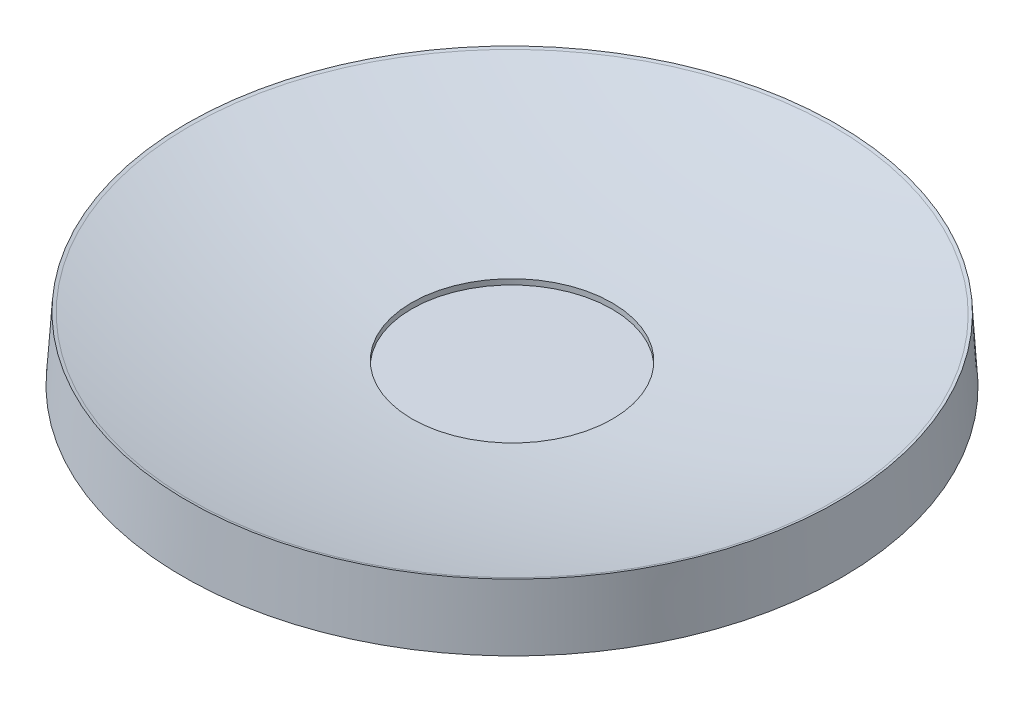
ISO-10303-21;
HEADER;
FILE_DESCRIPTION(('STEP AP214'),'2;1');
FILE_NAME('part.step','',(''),(''),'','','');
FILE_SCHEMA(('AUTOMOTIVE_DESIGN { 1 0 10303 214 1 1 1 1 }'));
ENDSEC;
DATA;
#1=APPLICATION_CONTEXT('core data for automotive mechanical design processes');
#2=APPLICATION_PROTOCOL_DEFINITION('international standard','automotive_design',2000,#1);
#3=PRODUCT_CONTEXT('',#1,'mechanical');
#4=PRODUCT('Part','Part','',(#3));
#5=PRODUCT_RELATED_PRODUCT_CATEGORY('part','',(#4));
#6=PRODUCT_DEFINITION_FORMATION('','',#4);
#7=PRODUCT_DEFINITION_CONTEXT('part definition',#1,'design');
#8=PRODUCT_DEFINITION('design','',#6,#7);
#9=PRODUCT_DEFINITION_SHAPE('','',#8);
#10=(LENGTH_UNIT() NAMED_UNIT(*) SI_UNIT(.MILLI.,.METRE.));
#11=(NAMED_UNIT(*) PLANE_ANGLE_UNIT() SI_UNIT($,.RADIAN.));
#12=(NAMED_UNIT(*) SI_UNIT($,.STERADIAN.) SOLID_ANGLE_UNIT());
#13=UNCERTAINTY_MEASURE_WITH_UNIT(LENGTH_MEASURE(1.E-05),#10,'distance_accuracy_value','');
#14=(GEOMETRIC_REPRESENTATION_CONTEXT(3) GLOBAL_UNCERTAINTY_ASSIGNED_CONTEXT((#13)) GLOBAL_UNIT_ASSIGNED_CONTEXT((#10,
#11,#12)) REPRESENTATION_CONTEXT('',''));
#15=CARTESIAN_POINT('',(0.,0.,0.));
#16=DIRECTION('',(0.,0.,1.));
#17=DIRECTION('',(1.,0.,0.));
#18=AXIS2_PLACEMENT_3D('',#15,#16,#17);
#19=CARTESIAN_POINT('',(0.00790986996643766,2.46044410241024,0.));
#20=DIRECTION('',(0.0032147973142897,0.999994832525763,0.));
#21=DIRECTION('',(-0.999994832525763,0.0032147973142897,0.));
#22=AXIS2_PLACEMENT_3D('',#19,#20,#21);
#23=CONICAL_SURFACE('',#22,4.0108609609319,1.56758189769856);
#24=CARTESIAN_POINT('',(0.00786842263725679,2.44755149645383,0.));
#25=VERTEX_POINT('',#24);
#26=VERTEX_LOOP('',#25);
#27=FACE_BOUND('',#26,.T.);
#28=CARTESIAN_POINT('',(0.00790986996643766,2.46044410241024,0.));
#29=DIRECTION('',(0.0032147973142897,0.999994832525763,0.));
#30=DIRECTION('',(-0.999994832525763,0.0032147973142897,0.));
#31=AXIS2_PLACEMENT_3D('',#28,#29,#30);
#32=CIRCLE('',#31,4.0108609609319);
#33=CARTESIAN_POINT('',(-4.00293036494477,2.47333820745543,0.));
#34=VERTEX_POINT('',#33);
#35=EDGE_CURVE('E52',#34,#34,#32,.T.);
#36=ORIENTED_EDGE('',*,*,#35,.T.);
#37=EDGE_LOOP('',(#36));
#38=FACE_BOUND('',#37,.T.);
#39=ADVANCED_FACE('F34',(#27,#38),#23,.F.);
#40=CARTESIAN_POINT('',(0.,0.,0.));
#41=DIRECTION('',(0.0032147973142897,0.999994832525763,0.));
#42=DIRECTION('',(-0.999994832525763,0.0032147973142897,0.));
#43=AXIS2_PLACEMENT_3D('',#40,#41,#42);
#44=CONICAL_SURFACE('',#43,0.,1.56758152394313);
#45=CARTESIAN_POINT('',(3.00440225388404E-07,9.34549346351572E-05,0.));
#46=DIRECTION('',(0.0032147973142897,0.999994832525763,0.));
#47=DIRECTION('',(-0.999994832525763,0.0032147973142897,0.));
#48=AXIS2_PLACEMENT_3D('',#45,#46,#47);
#49=CIRCLE('',#48,0.0290702416043919);
#50=CARTESIAN_POINT('',(-0.029069790944442,0.000186909869270709,0.));
#51=VERTEX_POINT('',#50);
#52=EDGE_CURVE('E11',#51,#51,#49,.T.);
#53=ORIENTED_EDGE('',*,*,#52,.F.);
#54=EDGE_LOOP('',(#53));
#55=FACE_BOUND('',#54,.T.);
#56=CARTESIAN_POINT('',(0.,0.,0.));
#57=VERTEX_POINT('',#56);
#58=VERTEX_LOOP('',#57);
#59=FACE_BOUND('',#58,.T.);
#60=ADVANCED_FACE('F49',(#55,#59),#44,.T.);
#61=CARTESIAN_POINT('',(0.160578597496656,49.9495775354563,0.));
#62=DIRECTION('',(0.0032147973142897,0.999994832525763,0.));
#63=DIRECTION('',(-0.999994832525763,0.0032147973142897,0.));
#64=AXIS2_PLACEMENT_3D('',#61,#62,#63);
#65=DEGENERATE_TOROIDAL_SURFACE('',#64,0.131508885240546,49.9500003098673,.F.);
#66=CARTESIAN_POINT('',(0.00580214614883145,1.80481554485579,0.));
#67=DIRECTION('',(0.0032147973142897,0.999994832525763,0.));
#68=DIRECTION('',(-0.999994832525763,0.0032147973142897,0.));
#69=AXIS2_PLACEMENT_3D('',#66,#67,#68);
#70=CIRCLE('',#69,13.174898145746);
#71=CARTESIAN_POINT('',(-13.1690279186504,1.84717017203078,0.));
#72=VERTEX_POINT('',#71);
#73=EDGE_CURVE('E41',#72,#72,#70,.T.);
#74=ORIENTED_EDGE('',*,*,#73,.F.);
#75=EDGE_LOOP('',(#74));
#76=FACE_BOUND('',#75,.T.);
#77=ORIENTED_EDGE('',*,*,#52,.T.);
#78=EDGE_LOOP('',(#77));
#79=FACE_BOUND('',#78,.T.);
#80=ADVANCED_FACE('F69',(#76,#79),#65,.F.);
#81=CARTESIAN_POINT('',(0.00580214614883145,1.80481554485579,0.));
#82=DIRECTION('',(-0.0032147973142897,-0.999994832525763,0.));
#83=DIRECTION('',(0.999994832525763,-0.0032147973142897,0.));
#84=AXIS2_PLACEMENT_3D('',#81,#82,#83);
#85=CONICAL_SURFACE('',#84,13.174898145746,0.0640347423915628);
#86=CARTESIAN_POINT('',(0.0139959100852803,4.35356770380649,0.));
#87=DIRECTION('',(0.0032147973142897,0.999994832525763,0.));
#88=DIRECTION('',(-0.999994832525763,0.0032147973142897,0.));
#89=AXIS2_PLACEMENT_3D('',#86,#87,#88);
#90=CIRCLE('',#89,13.0114651705399);
#91=CARTESIAN_POINT('',(-12.9974020240436,4.39539692709172,0.));
#92=VERTEX_POINT('',#91);
#93=EDGE_CURVE('E62',#92,#92,#90,.T.);
#94=ORIENTED_EDGE('',*,*,#93,.F.);
#95=EDGE_LOOP('',(#94));
#96=FACE_BOUND('',#95,.T.);
#97=ORIENTED_EDGE('',*,*,#73,.T.);
#98=EDGE_LOOP('',(#97));
#99=FACE_BOUND('',#98,.T.);
#100=ADVANCED_FACE('F67',(#96,#99),#85,.T.);
#101=CARTESIAN_POINT('',(0.0139959100852803,4.35356770380649,0.));
#102=DIRECTION('',(0.0032147973142897,0.999994832525763,0.));
#103=DIRECTION('',(-0.999994832525763,0.0032147973142897,0.));
#104=AXIS2_PLACEMENT_3D('',#101,#102,#103);
#105=CONICAL_SURFACE('',#104,13.0114651705399,1.29278974039302);
#106=CARTESIAN_POINT('',(0.0138857685101162,4.31930706612312,0.));
#107=DIRECTION('',(0.0032147973142897,0.999994832525763,0.));
#108=DIRECTION('',(-0.999994832525763,0.0032147973142897,0.));
#109=AXIS2_PLACEMENT_3D('',#106,#107,#108);
#110=CIRCLE('',#109,12.8914191403826);
#111=CARTESIAN_POINT('',(-12.8774667557962,4.36075036575301,0.));
#112=VERTEX_POINT('',#111);
#113=EDGE_CURVE('E57',#112,#112,#110,.T.);
#114=ORIENTED_EDGE('',*,*,#113,.F.);
#115=EDGE_LOOP('',(#114));
#116=FACE_BOUND('',#115,.T.);
#117=ORIENTED_EDGE('',*,*,#93,.T.);
#118=EDGE_LOOP('',(#117));
#119=FACE_BOUND('',#118,.T.);
#120=ADVANCED_FACE('F81',(#116,#119),#105,.F.);
#121=CARTESIAN_POINT('',(0.160578597496656,49.9495775354563,0.));
#122=DIRECTION('',(0.0032147973142897,0.999994832525763,0.));
#123=DIRECTION('',(-0.999994832525763,0.0032147973142897,0.));
#124=AXIS2_PLACEMENT_3D('',#121,#122,#123);
#125=DEGENERATE_TOROIDAL_SURFACE('',#124,0.131508885240546,47.452500000012,.F.);
#126=CARTESIAN_POINT('',(0.00861059117392023,2.67841043683796,0.));
#127=DIRECTION('',(0.0032147973142897,0.999994832525763,0.));
#128=DIRECTION('',(-0.999994832525763,0.0032147973142897,0.));
#129=AXIS2_PLACEMENT_3D('',#126,#127,#128);
#130=CIRCLE('',#129,4.01016023610344);
#131=CARTESIAN_POINT('',(-4.00152892252981,2.69130228919485,0.));
#132=VERTEX_POINT('',#131);
#133=EDGE_CURVE('E54',#132,#132,#130,.T.);
#134=ORIENTED_EDGE('',*,*,#133,.F.);
#135=EDGE_LOOP('',(#134));
#136=FACE_BOUND('',#135,.T.);
#137=ORIENTED_EDGE('',*,*,#113,.T.);
#138=EDGE_LOOP('',(#137));
#139=FACE_BOUND('',#138,.T.);
#140=ADVANCED_FACE('F85',(#136,#139),#125,.T.);
#141=CARTESIAN_POINT('',(0.00861059117392023,2.67841043683796,0.));
#142=DIRECTION('',(-0.0032147973142897,-0.999994832525763,0.));
#143=DIRECTION('',(0.999994832525763,-0.0032147973142897,0.));
#144=AXIS2_PLACEMENT_3D('',#141,#142,#143);
#145=CONICAL_SURFACE('',#144,4.01016023610344,0.00321480285174774);
#146=ORIENTED_EDGE('',*,*,#35,.F.);
#147=EDGE_LOOP('',(#146));
#148=FACE_BOUND('',#147,.T.);
#149=ORIENTED_EDGE('',*,*,#133,.T.);
#150=EDGE_LOOP('',(#149));
#151=FACE_BOUND('',#150,.T.);
#152=ADVANCED_FACE('F89',(#148,#151),#145,.F.);
#153=CLOSED_SHELL('',(#39,#60,#80,#100,#120,#140,#152));
#154=MANIFOLD_SOLID_BREP('B2',#153);
#155=ADVANCED_BREP_SHAPE_REPRESENTATION('',(#18,#154),#14);
#156=SHAPE_DEFINITION_REPRESENTATION(#9,#155);
ENDSEC;
END-ISO-10303-21;
